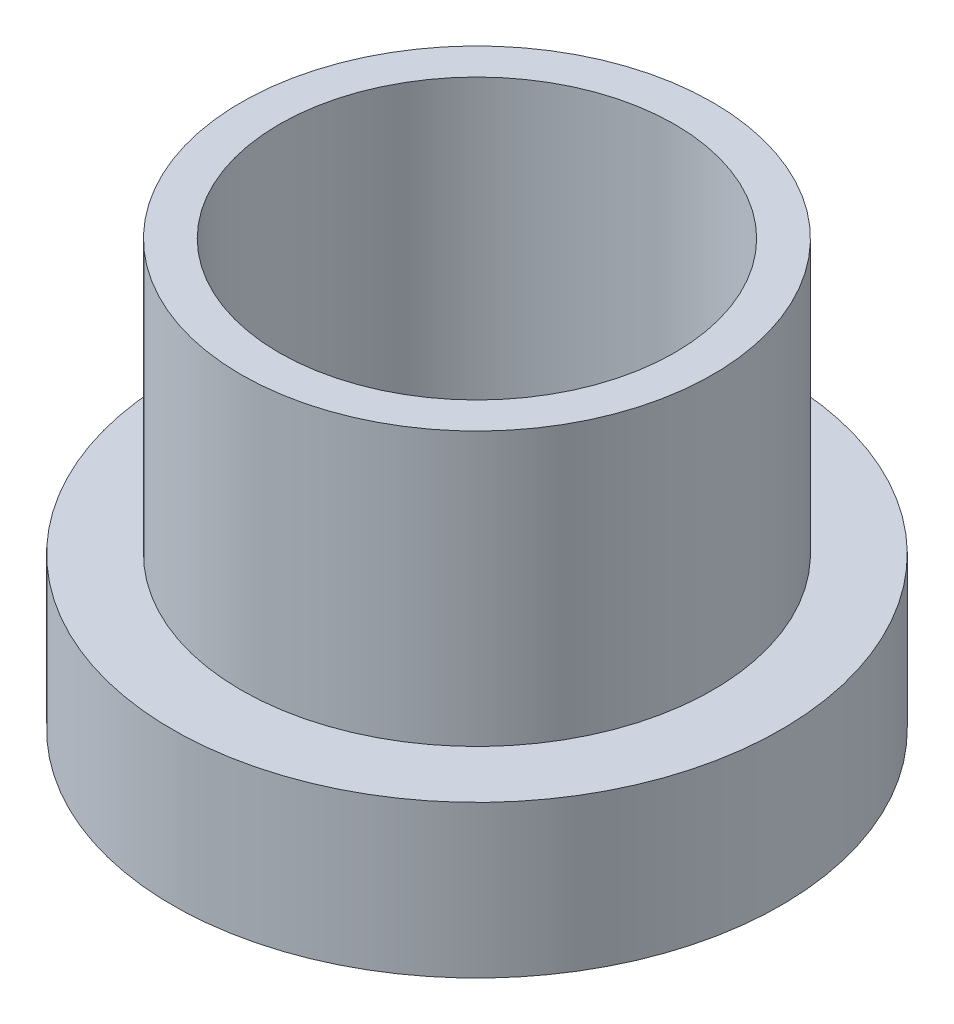
ISO-10303-21;
HEADER;
FILE_DESCRIPTION(('STEP AP214'),'2;1');
FILE_NAME('part.step','',(''),(''),'','','');
FILE_SCHEMA(('AUTOMOTIVE_DESIGN { 1 0 10303 214 1 1 1 1 }'));
ENDSEC;
DATA;
#1=APPLICATION_CONTEXT('core data for automotive mechanical design processes');
#2=APPLICATION_PROTOCOL_DEFINITION('international standard','automotive_design',2000,#1);
#3=PRODUCT_CONTEXT('',#1,'mechanical');
#4=PRODUCT('Part','Part','',(#3));
#5=PRODUCT_RELATED_PRODUCT_CATEGORY('part','',(#4));
#6=PRODUCT_DEFINITION_FORMATION('','',#4);
#7=PRODUCT_DEFINITION_CONTEXT('part definition',#1,'design');
#8=PRODUCT_DEFINITION('design','',#6,#7);
#9=PRODUCT_DEFINITION_SHAPE('','',#8);
#10=(LENGTH_UNIT() NAMED_UNIT(*) SI_UNIT(.MILLI.,.METRE.));
#11=(NAMED_UNIT(*) PLANE_ANGLE_UNIT() SI_UNIT($,.RADIAN.));
#12=(NAMED_UNIT(*) SI_UNIT($,.STERADIAN.) SOLID_ANGLE_UNIT());
#13=UNCERTAINTY_MEASURE_WITH_UNIT(LENGTH_MEASURE(1.E-05),#10,'distance_accuracy_value','');
#14=(GEOMETRIC_REPRESENTATION_CONTEXT(3) GLOBAL_UNCERTAINTY_ASSIGNED_CONTEXT((#13)) GLOBAL_UNIT_ASSIGNED_CONTEXT((#10,
#11,#12)) REPRESENTATION_CONTEXT('',''));
#15=CARTESIAN_POINT('',(0.,0.,0.));
#16=DIRECTION('',(0.,0.,1.));
#17=DIRECTION('',(1.,0.,0.));
#18=AXIS2_PLACEMENT_3D('',#15,#16,#17);
#19=CARTESIAN_POINT('',(0.,5.590882,0.));
#20=DIRECTION('',(0.,-1.,0.));
#21=DIRECTION('',(0.,0.,-1.));
#22=AXIS2_PLACEMENT_3D('',#19,#20,#21);
#23=CYLINDRICAL_SURFACE('',#22,3.1);
#24=CARTESIAN_POINT('',(0.,5.590882,0.));
#25=DIRECTION('',(0.,1.,0.));
#26=DIRECTION('',(0.,0.,1.));
#27=AXIS2_PLACEMENT_3D('',#24,#25,#26);
#28=CIRCLE('',#27,3.1);
#29=CARTESIAN_POINT('',(0.,5.590882,3.1));
#30=VERTEX_POINT('',#29);
#31=EDGE_CURVE('E48',#30,#30,#28,.T.);
#32=ORIENTED_EDGE('',*,*,#31,.F.);
#33=EDGE_LOOP('',(#32));
#34=FACE_BOUND('',#33,.T.);
#35=CARTESIAN_POINT('',(0.,2.,0.));
#36=DIRECTION('',(0.,-1.,0.));
#37=DIRECTION('',(0.,0.,-1.));
#38=AXIS2_PLACEMENT_3D('',#35,#36,#37);
#39=CIRCLE('',#38,3.1);
#40=CARTESIAN_POINT('',(0.,2.,-3.1));
#41=VERTEX_POINT('',#40);
#42=EDGE_CURVE('E10',#41,#41,#39,.T.);
#43=ORIENTED_EDGE('',*,*,#42,.F.);
#44=EDGE_LOOP('',(#43));
#45=FACE_BOUND('',#44,.T.);
#46=ADVANCED_FACE('F45',(#34,#45),#23,.T.);
#47=CARTESIAN_POINT('',(0.,5.590882,0.));
#48=DIRECTION('',(0.,1.,0.));
#49=DIRECTION('',(0.,0.,1.));
#50=AXIS2_PLACEMENT_3D('',#47,#48,#49);
#51=PLANE('',#50);
#52=ORIENTED_EDGE('',*,*,#31,.T.);
#53=EDGE_LOOP('',(#52));
#54=FACE_BOUND('',#53,.T.);
#55=CARTESIAN_POINT('',(0.,5.590882,0.));
#56=DIRECTION('',(0.,1.,0.));
#57=DIRECTION('',(0.,0.,1.));
#58=AXIS2_PLACEMENT_3D('',#55,#56,#57);
#59=CIRCLE('',#58,2.6);
#60=CARTESIAN_POINT('',(0.,5.590882,2.6));
#61=VERTEX_POINT('',#60);
#62=EDGE_CURVE('E56',#61,#61,#59,.T.);
#63=ORIENTED_EDGE('',*,*,#62,.F.);
#64=EDGE_LOOP('',(#63));
#65=FACE_BOUND('',#64,.T.);
#66=ADVANCED_FACE('F87',(#54,#65),#51,.T.);
#67=CARTESIAN_POINT('',(0.,0.,0.));
#68=DIRECTION('',(0.,1.,0.));
#69=DIRECTION('',(0.,0.,1.));
#70=AXIS2_PLACEMENT_3D('',#67,#68,#69);
#71=PLANE('',#70);
#72=CARTESIAN_POINT('',(0.,0.,0.));
#73=DIRECTION('',(0.,1.,0.));
#74=DIRECTION('',(0.,0.,1.));
#75=AXIS2_PLACEMENT_3D('',#72,#73,#74);
#76=CIRCLE('',#75,2.6);
#77=CARTESIAN_POINT('',(0.,0.,2.6));
#78=VERTEX_POINT('',#77);
#79=EDGE_CURVE('E62',#78,#78,#76,.T.);
#80=ORIENTED_EDGE('',*,*,#79,.T.);
#81=EDGE_LOOP('',(#80));
#82=FACE_BOUND('',#81,.T.);
#83=CARTESIAN_POINT('',(0.,0.,0.));
#84=DIRECTION('',(0.,-1.,0.));
#85=DIRECTION('',(0.,0.,-1.));
#86=AXIS2_PLACEMENT_3D('',#83,#84,#85);
#87=CIRCLE('',#86,4.);
#88=CARTESIAN_POINT('',(0.,0.,-4.));
#89=VERTEX_POINT('',#88);
#90=EDGE_CURVE('E59',#89,#89,#87,.T.);
#91=ORIENTED_EDGE('',*,*,#90,.T.);
#92=EDGE_LOOP('',(#91));
#93=FACE_BOUND('',#92,.T.);
#94=ADVANCED_FACE('F73',(#82,#93),#71,.F.);
#95=CARTESIAN_POINT('',(0.,5.590882,0.));
#96=DIRECTION('',(0.,-1.,0.));
#97=DIRECTION('',(0.,0.,-1.));
#98=AXIS2_PLACEMENT_3D('',#95,#96,#97);
#99=CYLINDRICAL_SURFACE('',#98,2.6);
#100=ORIENTED_EDGE('',*,*,#79,.F.);
#101=EDGE_LOOP('',(#100));
#102=FACE_BOUND('',#101,.T.);
#103=ORIENTED_EDGE('',*,*,#62,.T.);
#104=EDGE_LOOP('',(#103));
#105=FACE_BOUND('',#104,.T.);
#106=ADVANCED_FACE('F82',(#102,#105),#99,.F.);
#107=CARTESIAN_POINT('',(0.,2.,0.));
#108=DIRECTION('',(0.,-1.,0.));
#109=DIRECTION('',(0.,0.,-1.));
#110=AXIS2_PLACEMENT_3D('',#107,#108,#109);
#111=PLANE('',#110);
#112=CARTESIAN_POINT('',(0.,2.,0.));
#113=DIRECTION('',(0.,-1.,0.));
#114=DIRECTION('',(0.,0.,-1.));
#115=AXIS2_PLACEMENT_3D('',#112,#113,#114);
#116=CIRCLE('',#115,4.);
#117=CARTESIAN_POINT('',(0.,2.,-4.));
#118=VERTEX_POINT('',#117);
#119=EDGE_CURVE('E64',#118,#118,#116,.T.);
#120=ORIENTED_EDGE('',*,*,#119,.F.);
#121=EDGE_LOOP('',(#120));
#122=FACE_BOUND('',#121,.T.);
#123=ORIENTED_EDGE('',*,*,#42,.T.);
#124=EDGE_LOOP('',(#123));
#125=FACE_BOUND('',#124,.T.);
#126=ADVANCED_FACE('F77',(#122,#125),#111,.F.);
#127=CARTESIAN_POINT('',(0.,2.,0.));
#128=DIRECTION('',(0.,-1.,0.));
#129=DIRECTION('',(0.,0.,-1.));
#130=AXIS2_PLACEMENT_3D('',#127,#128,#129);
#131=CYLINDRICAL_SURFACE('',#130,4.);
#132=ORIENTED_EDGE('',*,*,#119,.T.);
#133=EDGE_LOOP('',(#132));
#134=FACE_BOUND('',#133,.T.);
#135=ORIENTED_EDGE('',*,*,#90,.F.);
#136=EDGE_LOOP('',(#135));
#137=FACE_BOUND('',#136,.T.);
#138=ADVANCED_FACE('F75',(#134,#137),#131,.T.);
#139=CLOSED_SHELL('',(#46,#66,#94,#106,#126,#138));
#140=MANIFOLD_SOLID_BREP('B2',#139);
#141=ADVANCED_BREP_SHAPE_REPRESENTATION('',(#18,#140),#14);
#142=SHAPE_DEFINITION_REPRESENTATION(#9,#141);
ENDSEC;
END-ISO-10303-21;
